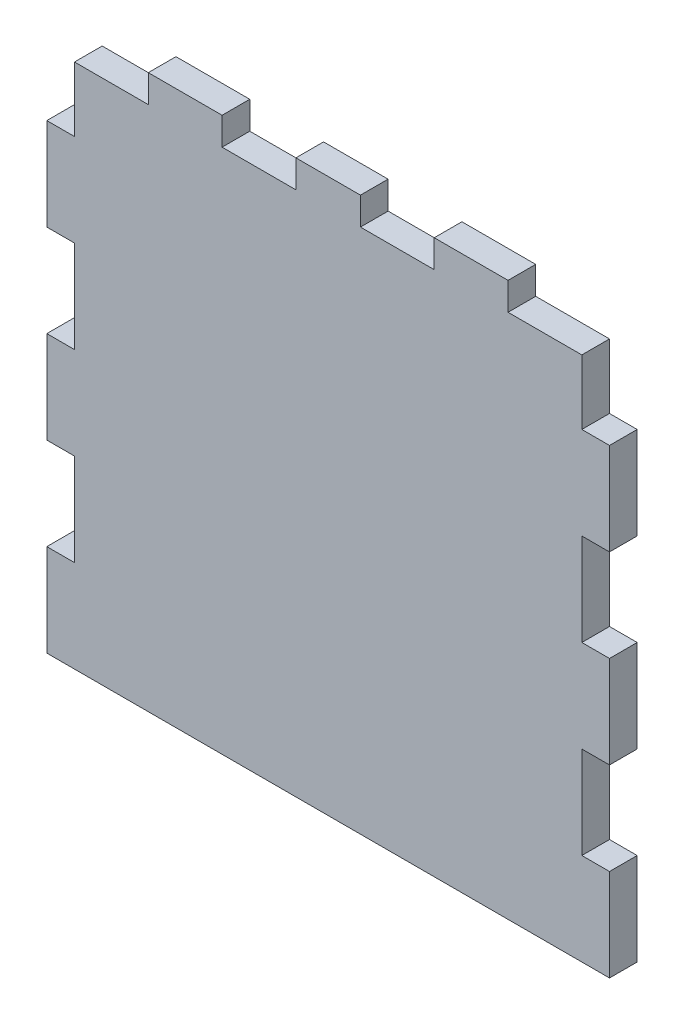
ISO-10303-21;
HEADER;
FILE_DESCRIPTION(('STEP AP214'),'2;1');
FILE_NAME('part.step','',(''),(''),'','','');
FILE_SCHEMA(('AUTOMOTIVE_DESIGN { 1 0 10303 214 1 1 1 1 }'));
ENDSEC;
DATA;
#1=APPLICATION_CONTEXT('core data for automotive mechanical design processes');
#2=APPLICATION_PROTOCOL_DEFINITION('international standard','automotive_design',2000,#1);
#3=PRODUCT_CONTEXT('',#1,'mechanical');
#4=PRODUCT('Part','Part','',(#3));
#5=PRODUCT_RELATED_PRODUCT_CATEGORY('part','',(#4));
#6=PRODUCT_DEFINITION_FORMATION('','',#4);
#7=PRODUCT_DEFINITION_CONTEXT('part definition',#1,'design');
#8=PRODUCT_DEFINITION('design','',#6,#7);
#9=PRODUCT_DEFINITION_SHAPE('','',#8);
#10=(LENGTH_UNIT() NAMED_UNIT(*) SI_UNIT(.MILLI.,.METRE.));
#11=(NAMED_UNIT(*) PLANE_ANGLE_UNIT() SI_UNIT($,.RADIAN.));
#12=(NAMED_UNIT(*) SI_UNIT($,.STERADIAN.) SOLID_ANGLE_UNIT());
#13=UNCERTAINTY_MEASURE_WITH_UNIT(LENGTH_MEASURE(1.E-05),#10,'distance_accuracy_value','');
#14=(GEOMETRIC_REPRESENTATION_CONTEXT(3) GLOBAL_UNCERTAINTY_ASSIGNED_CONTEXT((#13)) GLOBAL_UNIT_ASSIGNED_CONTEXT((#10,
#11,#12)) REPRESENTATION_CONTEXT('',''));
#15=CARTESIAN_POINT('',(0.,0.,0.));
#16=DIRECTION('',(0.,0.,1.));
#17=DIRECTION('',(1.,0.,0.));
#18=AXIS2_PLACEMENT_3D('',#15,#16,#17);
#19=CARTESIAN_POINT('',(0.,-60.,3.));
#20=DIRECTION('',(0.,1.,0.));
#21=DIRECTION('',(0.,0.,1.));
#22=AXIS2_PLACEMENT_3D('',#19,#20,#21);
#23=PLANE('',#22);
#24=DIRECTION('',(1.,0.,0.));
#25=VECTOR('',#24,1.);
#26=CARTESIAN_POINT('',(0.,-60.,0.));
#27=LINE('',#26,#25);
#28=CARTESIAN_POINT('',(-30.5,-60.,0.));
#29=VERTEX_POINT('',#28);
#30=CARTESIAN_POINT('',(30.5,-60.,0.));
#31=VERTEX_POINT('',#30);
#32=EDGE_CURVE('E303',#29,#31,#27,.T.);
#33=ORIENTED_EDGE('',*,*,#32,.T.);
#34=DIRECTION('',(0.,0.,-1.));
#35=VECTOR('',#34,1.);
#36=CARTESIAN_POINT('',(30.5,-60.,3.));
#37=LINE('',#36,#35);
#38=CARTESIAN_POINT('',(30.5,-60.,3.));
#39=VERTEX_POINT('',#38);
#40=EDGE_CURVE('E11',#39,#31,#37,.T.);
#41=ORIENTED_EDGE('',*,*,#40,.F.);
#42=DIRECTION('',(1.,0.,0.));
#43=VECTOR('',#42,1.);
#44=CARTESIAN_POINT('',(0.,-60.,3.));
#45=LINE('',#44,#43);
#46=CARTESIAN_POINT('',(-30.5,-60.,3.));
#47=VERTEX_POINT('',#46);
#48=EDGE_CURVE('E379',#47,#39,#45,.T.);
#49=ORIENTED_EDGE('',*,*,#48,.F.);
#50=DIRECTION('',(0.,0.,-1.));
#51=VECTOR('',#50,1.);
#52=CARTESIAN_POINT('',(-30.5,-60.,3.));
#53=LINE('',#52,#51);
#54=EDGE_CURVE('E298',#47,#29,#53,.T.);
#55=ORIENTED_EDGE('',*,*,#54,.T.);
#56=EDGE_LOOP('',(#33,#41,#49,#55));
#57=FACE_BOUND('',#56,.T.);
#58=ADVANCED_FACE('F37',(#57),#23,.F.);
#59=CARTESIAN_POINT('',(30.5,0.,3.));
#60=DIRECTION('',(-1.,0.,0.));
#61=DIRECTION('',(0.,0.,1.));
#62=AXIS2_PLACEMENT_3D('',#59,#60,#61);
#63=PLANE('',#62);
#64=DIRECTION('',(0.,1.,0.));
#65=VECTOR('',#64,1.);
#66=CARTESIAN_POINT('',(30.5,0.,0.));
#67=LINE('',#66,#65);
#68=CARTESIAN_POINT('',(30.5,-50.,0.));
#69=VERTEX_POINT('',#68);
#70=EDGE_CURVE('E306',#31,#69,#67,.T.);
#71=ORIENTED_EDGE('',*,*,#70,.T.);
#72=DIRECTION('',(0.,0.,-1.));
#73=VECTOR('',#72,1.);
#74=CARTESIAN_POINT('',(30.5,-50.,3.));
#75=LINE('',#74,#73);
#76=CARTESIAN_POINT('',(30.5,-50.,3.));
#77=VERTEX_POINT('',#76);
#78=EDGE_CURVE('E45',#77,#69,#75,.T.);
#79=ORIENTED_EDGE('',*,*,#78,.F.);
#80=DIRECTION('',(0.,1.,0.));
#81=VECTOR('',#80,1.);
#82=CARTESIAN_POINT('',(30.5,0.,3.));
#83=LINE('',#82,#81);
#84=EDGE_CURVE('E176',#39,#77,#83,.T.);
#85=ORIENTED_EDGE('',*,*,#84,.F.);
#86=ORIENTED_EDGE('',*,*,#40,.T.);
#87=EDGE_LOOP('',(#71,#79,#85,#86));
#88=FACE_BOUND('',#87,.T.);
#89=ADVANCED_FACE('F570',(#88),#63,.F.);
#90=CARTESIAN_POINT('',(0.,-50.,3.));
#91=DIRECTION('',(0.,-1.,0.));
#92=DIRECTION('',(0.,0.,-1.));
#93=AXIS2_PLACEMENT_3D('',#90,#91,#92);
#94=PLANE('',#93);
#95=DIRECTION('',(-1.,0.,0.));
#96=VECTOR('',#95,1.);
#97=CARTESIAN_POINT('',(0.,-50.,0.));
#98=LINE('',#97,#96);
#99=CARTESIAN_POINT('',(27.5,-50.,0.));
#100=VERTEX_POINT('',#99);
#101=EDGE_CURVE('E308',#69,#100,#98,.T.);
#102=ORIENTED_EDGE('',*,*,#101,.T.);
#103=DIRECTION('',(0.,0.,-1.));
#104=VECTOR('',#103,1.);
#105=CARTESIAN_POINT('',(27.5,-50.,3.));
#106=LINE('',#105,#104);
#107=CARTESIAN_POINT('',(27.5,-50.,3.));
#108=VERTEX_POINT('',#107);
#109=EDGE_CURVE('E456',#108,#100,#106,.T.);
#110=ORIENTED_EDGE('',*,*,#109,.F.);
#111=DIRECTION('',(-1.,0.,0.));
#112=VECTOR('',#111,1.);
#113=CARTESIAN_POINT('',(0.,-50.,3.));
#114=LINE('',#113,#112);
#115=EDGE_CURVE('E464',#77,#108,#114,.T.);
#116=ORIENTED_EDGE('',*,*,#115,.F.);
#117=ORIENTED_EDGE('',*,*,#78,.T.);
#118=EDGE_LOOP('',(#102,#110,#116,#117));
#119=FACE_BOUND('',#118,.T.);
#120=ADVANCED_FACE('F462',(#119),#94,.F.);
#121=CARTESIAN_POINT('',(27.5,0.,3.));
#122=DIRECTION('',(-1.,0.,0.));
#123=DIRECTION('',(0.,-1.,0.));
#124=AXIS2_PLACEMENT_3D('',#121,#122,#123);
#125=PLANE('',#124);
#126=DIRECTION('',(0.,1.,0.));
#127=VECTOR('',#126,1.);
#128=CARTESIAN_POINT('',(27.5,0.,0.));
#129=LINE('',#128,#127);
#130=CARTESIAN_POINT('',(27.5,-40.,0.));
#131=VERTEX_POINT('',#130);
#132=EDGE_CURVE('E310',#100,#131,#129,.T.);
#133=ORIENTED_EDGE('',*,*,#132,.T.);
#134=DIRECTION('',(0.,0.,-1.));
#135=VECTOR('',#134,1.);
#136=CARTESIAN_POINT('',(27.5,-40.,3.));
#137=LINE('',#136,#135);
#138=CARTESIAN_POINT('',(27.5,-40.,3.));
#139=VERTEX_POINT('',#138);
#140=EDGE_CURVE('E454',#139,#131,#137,.T.);
#141=ORIENTED_EDGE('',*,*,#140,.F.);
#142=DIRECTION('',(0.,1.,0.));
#143=VECTOR('',#142,1.);
#144=CARTESIAN_POINT('',(27.5,0.,3.));
#145=LINE('',#144,#143);
#146=EDGE_CURVE('E476',#108,#139,#145,.T.);
#147=ORIENTED_EDGE('',*,*,#146,.F.);
#148=ORIENTED_EDGE('',*,*,#109,.T.);
#149=EDGE_LOOP('',(#133,#141,#147,#148));
#150=FACE_BOUND('',#149,.T.);
#151=ADVANCED_FACE('F473',(#150),#125,.F.);
#152=CARTESIAN_POINT('',(0.,-40.,3.));
#153=DIRECTION('',(0.,-1.,0.));
#154=DIRECTION('',(0.,0.,-1.));
#155=AXIS2_PLACEMENT_3D('',#152,#153,#154);
#156=PLANE('',#155);
#157=DIRECTION('',(-1.,0.,0.));
#158=VECTOR('',#157,1.);
#159=CARTESIAN_POINT('',(0.,-40.,0.));
#160=LINE('',#159,#158);
#161=CARTESIAN_POINT('',(30.5,-40.,0.));
#162=VERTEX_POINT('',#161);
#163=EDGE_CURVE('E313',#162,#131,#160,.T.);
#164=ORIENTED_EDGE('',*,*,#163,.F.);
#165=DIRECTION('',(0.,0.,-1.));
#166=VECTOR('',#165,1.);
#167=CARTESIAN_POINT('',(30.5,-40.,3.));
#168=LINE('',#167,#166);
#169=CARTESIAN_POINT('',(30.5,-40.,3.));
#170=VERTEX_POINT('',#169);
#171=EDGE_CURVE('E452',#170,#162,#168,.T.);
#172=ORIENTED_EDGE('',*,*,#171,.F.);
#173=DIRECTION('',(-1.,0.,0.));
#174=VECTOR('',#173,1.);
#175=CARTESIAN_POINT('',(0.,-40.,3.));
#176=LINE('',#175,#174);
#177=EDGE_CURVE('E478',#170,#139,#176,.T.);
#178=ORIENTED_EDGE('',*,*,#177,.T.);
#179=ORIENTED_EDGE('',*,*,#140,.T.);
#180=EDGE_LOOP('',(#164,#172,#178,#179));
#181=FACE_BOUND('',#180,.T.);
#182=ADVANCED_FACE('F938',(#181),#156,.T.);
#183=CARTESIAN_POINT('',(30.5,0.,3.));
#184=DIRECTION('',(-1.,0.,0.));
#185=DIRECTION('',(0.,0.,1.));
#186=AXIS2_PLACEMENT_3D('',#183,#184,#185);
#187=PLANE('',#186);
#188=DIRECTION('',(0.,1.,0.));
#189=VECTOR('',#188,1.);
#190=CARTESIAN_POINT('',(30.5,0.,0.));
#191=LINE('',#190,#189);
#192=CARTESIAN_POINT('',(30.5,-30.,0.));
#193=VERTEX_POINT('',#192);
#194=EDGE_CURVE('E318',#162,#193,#191,.T.);
#195=ORIENTED_EDGE('',*,*,#194,.T.);
#196=DIRECTION('',(0.,0.,-1.));
#197=VECTOR('',#196,1.);
#198=CARTESIAN_POINT('',(30.5,-30.,3.));
#199=LINE('',#198,#197);
#200=CARTESIAN_POINT('',(30.5,-30.,3.));
#201=VERTEX_POINT('',#200);
#202=EDGE_CURVE('E449',#201,#193,#199,.T.);
#203=ORIENTED_EDGE('',*,*,#202,.F.);
#204=DIRECTION('',(0.,1.,0.));
#205=VECTOR('',#204,1.);
#206=CARTESIAN_POINT('',(30.5,0.,3.));
#207=LINE('',#206,#205);
#208=EDGE_CURVE('E482',#170,#201,#207,.T.);
#209=ORIENTED_EDGE('',*,*,#208,.F.);
#210=ORIENTED_EDGE('',*,*,#171,.T.);
#211=EDGE_LOOP('',(#195,#203,#209,#210));
#212=FACE_BOUND('',#211,.T.);
#213=ADVANCED_FACE('F928',(#212),#187,.F.);
#214=CARTESIAN_POINT('',(0.,-29.9999999999999,3.));
#215=DIRECTION('',(0.,-1.,0.));
#216=DIRECTION('',(1.,0.,0.));
#217=AXIS2_PLACEMENT_3D('',#214,#215,#216);
#218=PLANE('',#217);
#219=DIRECTION('',(-1.,0.,0.));
#220=VECTOR('',#219,1.);
#221=CARTESIAN_POINT('',(0.,-29.9999999999999,0.));
#222=LINE('',#221,#220);
#223=CARTESIAN_POINT('',(27.5,-30.,0.));
#224=VERTEX_POINT('',#223);
#225=EDGE_CURVE('E320',#193,#224,#222,.T.);
#226=ORIENTED_EDGE('',*,*,#225,.T.);
#227=DIRECTION('',(0.,0.,-1.));
#228=VECTOR('',#227,1.);
#229=CARTESIAN_POINT('',(27.5,-30.,3.));
#230=LINE('',#229,#228);
#231=CARTESIAN_POINT('',(27.5,-30.,3.));
#232=VERTEX_POINT('',#231);
#233=EDGE_CURVE('E446',#232,#224,#230,.T.);
#234=ORIENTED_EDGE('',*,*,#233,.F.);
#235=DIRECTION('',(-1.,0.,0.));
#236=VECTOR('',#235,1.);
#237=CARTESIAN_POINT('',(0.,-29.9999999999999,3.));
#238=LINE('',#237,#236);
#239=EDGE_CURVE('E488',#201,#232,#238,.T.);
#240=ORIENTED_EDGE('',*,*,#239,.F.);
#241=ORIENTED_EDGE('',*,*,#202,.T.);
#242=EDGE_LOOP('',(#226,#234,#240,#241));
#243=FACE_BOUND('',#242,.T.);
#244=ADVANCED_FACE('F919',(#243),#218,.F.);
#245=CARTESIAN_POINT('',(27.5,-20.,0.));
#246=VERTEX_POINT('',#245);
#247=EDGE_CURVE('E315',#224,#246,#129,.T.);
#248=ORIENTED_EDGE('',*,*,#247,.T.);
#249=DIRECTION('',(0.,0.,-1.));
#250=VECTOR('',#249,1.);
#251=CARTESIAN_POINT('',(27.5,-20.,3.));
#252=LINE('',#251,#250);
#253=CARTESIAN_POINT('',(27.5,-20.,3.));
#254=VERTEX_POINT('',#253);
#255=EDGE_CURVE('E444',#254,#246,#252,.T.);
#256=ORIENTED_EDGE('',*,*,#255,.F.);
#257=EDGE_CURVE('E481',#232,#254,#145,.T.);
#258=ORIENTED_EDGE('',*,*,#257,.F.);
#259=ORIENTED_EDGE('',*,*,#233,.T.);
#260=EDGE_LOOP('',(#248,#256,#258,#259));
#261=FACE_BOUND('',#260,.T.);
#262=ADVANCED_FACE('F881',(#261),#125,.F.);
#263=CARTESIAN_POINT('',(0.,-19.9999999999999,3.));
#264=DIRECTION('',(0.,-1.,0.));
#265=DIRECTION('',(1.,0.,0.));
#266=AXIS2_PLACEMENT_3D('',#263,#264,#265);
#267=PLANE('',#266);
#268=DIRECTION('',(-1.,0.,0.));
#269=VECTOR('',#268,1.);
#270=CARTESIAN_POINT('',(0.,-19.9999999999999,0.));
#271=LINE('',#270,#269);
#272=CARTESIAN_POINT('',(30.5,-20.,0.));
#273=VERTEX_POINT('',#272);
#274=EDGE_CURVE('E322',#273,#246,#271,.T.);
#275=ORIENTED_EDGE('',*,*,#274,.F.);
#276=DIRECTION('',(0.,0.,-1.));
#277=VECTOR('',#276,1.);
#278=CARTESIAN_POINT('',(30.5,-20.,3.));
#279=LINE('',#278,#277);
#280=CARTESIAN_POINT('',(30.5,-20.,3.));
#281=VERTEX_POINT('',#280);
#282=EDGE_CURVE('E442',#281,#273,#279,.T.);
#283=ORIENTED_EDGE('',*,*,#282,.F.);
#284=DIRECTION('',(-1.,0.,0.));
#285=VECTOR('',#284,1.);
#286=CARTESIAN_POINT('',(0.,-19.9999999999999,3.));
#287=LINE('',#286,#285);
#288=EDGE_CURVE('E487',#281,#254,#287,.T.);
#289=ORIENTED_EDGE('',*,*,#288,.T.);
#290=ORIENTED_EDGE('',*,*,#255,.T.);
#291=EDGE_LOOP('',(#275,#283,#289,#290));
#292=FACE_BOUND('',#291,.T.);
#293=ADVANCED_FACE('F899',(#292),#267,.T.);
#294=CARTESIAN_POINT('',(30.5,0.,3.));
#295=DIRECTION('',(-1.,0.,0.));
#296=DIRECTION('',(0.,0.,1.));
#297=AXIS2_PLACEMENT_3D('',#294,#295,#296);
#298=PLANE('',#297);
#299=DIRECTION('',(0.,1.,0.));
#300=VECTOR('',#299,1.);
#301=CARTESIAN_POINT('',(30.5,0.,0.));
#302=LINE('',#301,#300);
#303=CARTESIAN_POINT('',(30.5,-10.,0.));
#304=VERTEX_POINT('',#303);
#305=EDGE_CURVE('E325',#273,#304,#302,.T.);
#306=ORIENTED_EDGE('',*,*,#305,.T.);
#307=DIRECTION('',(0.,0.,-1.));
#308=VECTOR('',#307,1.);
#309=CARTESIAN_POINT('',(30.5,-10.,3.));
#310=LINE('',#309,#308);
#311=CARTESIAN_POINT('',(30.5,-10.,3.));
#312=VERTEX_POINT('',#311);
#313=EDGE_CURVE('E439',#312,#304,#310,.T.);
#314=ORIENTED_EDGE('',*,*,#313,.F.);
#315=DIRECTION('',(0.,1.,0.));
#316=VECTOR('',#315,1.);
#317=CARTESIAN_POINT('',(30.5,0.,3.));
#318=LINE('',#317,#316);
#319=EDGE_CURVE('E493',#281,#312,#318,.T.);
#320=ORIENTED_EDGE('',*,*,#319,.F.);
#321=ORIENTED_EDGE('',*,*,#282,.T.);
#322=EDGE_LOOP('',(#306,#314,#320,#321));
#323=FACE_BOUND('',#322,.T.);
#324=ADVANCED_FACE('F889',(#323),#298,.F.);
#325=CARTESIAN_POINT('',(0.,-10.,3.));
#326=DIRECTION('',(0.,-1.,0.));
#327=DIRECTION('',(0.,0.,-1.));
#328=AXIS2_PLACEMENT_3D('',#325,#326,#327);
#329=PLANE('',#328);
#330=DIRECTION('',(-1.,0.,0.));
#331=VECTOR('',#330,1.);
#332=CARTESIAN_POINT('',(0.,-10.,0.));
#333=LINE('',#332,#331);
#334=CARTESIAN_POINT('',(27.5,-10.,0.));
#335=VERTEX_POINT('',#334);
#336=EDGE_CURVE('E327',#304,#335,#333,.T.);
#337=ORIENTED_EDGE('',*,*,#336,.T.);
#338=DIRECTION('',(0.,0.,-1.));
#339=VECTOR('',#338,1.);
#340=CARTESIAN_POINT('',(27.5,-10.,3.));
#341=LINE('',#340,#339);
#342=CARTESIAN_POINT('',(27.5,-10.,3.));
#343=VERTEX_POINT('',#342);
#344=EDGE_CURVE('E436',#343,#335,#341,.T.);
#345=ORIENTED_EDGE('',*,*,#344,.F.);
#346=DIRECTION('',(-1.,0.,0.));
#347=VECTOR('',#346,1.);
#348=CARTESIAN_POINT('',(0.,-10.,3.));
#349=LINE('',#348,#347);
#350=EDGE_CURVE('E486',#312,#343,#349,.T.);
#351=ORIENTED_EDGE('',*,*,#350,.F.);
#352=ORIENTED_EDGE('',*,*,#313,.T.);
#353=EDGE_LOOP('',(#337,#345,#351,#352));
#354=FACE_BOUND('',#353,.T.);
#355=ADVANCED_FACE('F878',(#354),#329,.F.);
#356=CARTESIAN_POINT('',(27.5,-3.,0.));
#357=VERTEX_POINT('',#356);
#358=EDGE_CURVE('E314',#335,#357,#129,.T.);
#359=ORIENTED_EDGE('',*,*,#358,.T.);
#360=DIRECTION('',(0.,0.,-1.));
#361=VECTOR('',#360,1.);
#362=CARTESIAN_POINT('',(27.5,-3.,3.));
#363=LINE('',#362,#361);
#364=CARTESIAN_POINT('',(27.5,-3.,3.));
#365=VERTEX_POINT('',#364);
#366=EDGE_CURVE('E433',#365,#357,#363,.T.);
#367=ORIENTED_EDGE('',*,*,#366,.F.);
#368=EDGE_CURVE('E480',#343,#365,#145,.T.);
#369=ORIENTED_EDGE('',*,*,#368,.F.);
#370=ORIENTED_EDGE('',*,*,#344,.T.);
#371=EDGE_LOOP('',(#359,#367,#369,#370));
#372=FACE_BOUND('',#371,.T.);
#373=ADVANCED_FACE('F868',(#372),#125,.F.);
#374=CARTESIAN_POINT('',(0.,-3.,3.));
#375=DIRECTION('',(0.,-1.,0.));
#376=DIRECTION('',(0.,0.,-1.));
#377=AXIS2_PLACEMENT_3D('',#374,#375,#376);
#378=PLANE('',#377);
#379=DIRECTION('',(-1.,0.,0.));
#380=VECTOR('',#379,1.);
#381=CARTESIAN_POINT('',(0.,-3.,0.));
#382=LINE('',#381,#380);
#383=CARTESIAN_POINT('',(19.5000000000006,-3.,0.));
#384=VERTEX_POINT('',#383);
#385=EDGE_CURVE('E329',#357,#384,#382,.T.);
#386=ORIENTED_EDGE('',*,*,#385,.T.);
#387=DIRECTION('',(0.,0.,-1.));
#388=VECTOR('',#387,1.);
#389=CARTESIAN_POINT('',(19.5000000000006,-3.,3.));
#390=LINE('',#389,#388);
#391=CARTESIAN_POINT('',(19.5000000000006,-3.,3.));
#392=VERTEX_POINT('',#391);
#393=EDGE_CURVE('E431',#392,#384,#390,.T.);
#394=ORIENTED_EDGE('',*,*,#393,.F.);
#395=DIRECTION('',(-1.,0.,0.));
#396=VECTOR('',#395,1.);
#397=CARTESIAN_POINT('',(0.,-3.,3.));
#398=LINE('',#397,#396);
#399=EDGE_CURVE('E485',#365,#392,#398,.T.);
#400=ORIENTED_EDGE('',*,*,#399,.F.);
#401=ORIENTED_EDGE('',*,*,#366,.T.);
#402=EDGE_LOOP('',(#386,#394,#400,#401));
#403=FACE_BOUND('',#402,.T.);
#404=ADVANCED_FACE('F830',(#403),#378,.F.);
#405=CARTESIAN_POINT('',(19.5000000000006,0.,3.));
#406=DIRECTION('',(1.,0.,0.));
#407=DIRECTION('',(0.,0.,-1.));
#408=AXIS2_PLACEMENT_3D('',#405,#406,#407);
#409=PLANE('',#408);
#410=DIRECTION('',(0.,-1.,0.));
#411=VECTOR('',#410,1.);
#412=CARTESIAN_POINT('',(19.5000000000006,0.,0.));
#413=LINE('',#412,#411);
#414=CARTESIAN_POINT('',(19.5000000000006,0.,0.));
#415=VERTEX_POINT('',#414);
#416=EDGE_CURVE('E332',#415,#384,#413,.T.);
#417=ORIENTED_EDGE('',*,*,#416,.F.);
#418=DIRECTION('',(0.,0.,-1.));
#419=VECTOR('',#418,1.);
#420=CARTESIAN_POINT('',(19.5000000000006,0.,3.));
#421=LINE('',#420,#419);
#422=CARTESIAN_POINT('',(19.5000000000006,0.,3.));
#423=VERTEX_POINT('',#422);
#424=EDGE_CURVE('E429',#423,#415,#421,.T.);
#425=ORIENTED_EDGE('',*,*,#424,.F.);
#426=DIRECTION('',(0.,-1.,0.));
#427=VECTOR('',#426,1.);
#428=CARTESIAN_POINT('',(19.5000000000006,0.,3.));
#429=LINE('',#428,#427);
#430=EDGE_CURVE('E503',#423,#392,#429,.T.);
#431=ORIENTED_EDGE('',*,*,#430,.T.);
#432=ORIENTED_EDGE('',*,*,#393,.T.);
#433=EDGE_LOOP('',(#417,#425,#431,#432));
#434=FACE_BOUND('',#433,.T.);
#435=ADVANCED_FACE('F848',(#434),#409,.T.);
#436=CARTESIAN_POINT('',(0.,0.,3.));
#437=DIRECTION('',(0.,-1.,0.));
#438=DIRECTION('',(0.,0.,-1.));
#439=AXIS2_PLACEMENT_3D('',#436,#437,#438);
#440=PLANE('',#439);
#441=DIRECTION('',(-1.,0.,0.));
#442=VECTOR('',#441,1.);
#443=CARTESIAN_POINT('',(0.,0.,0.));
#444=LINE('',#443,#442);
#445=CARTESIAN_POINT('',(11.5,0.,0.));
#446=VERTEX_POINT('',#445);
#447=EDGE_CURVE('E336',#415,#446,#444,.T.);
#448=ORIENTED_EDGE('',*,*,#447,.T.);
#449=DIRECTION('',(0.,0.,-1.));
#450=VECTOR('',#449,1.);
#451=CARTESIAN_POINT('',(11.5,0.,3.));
#452=LINE('',#451,#450);
#453=CARTESIAN_POINT('',(11.5,0.,3.));
#454=VERTEX_POINT('',#453);
#455=EDGE_CURVE('E426',#454,#446,#452,.T.);
#456=ORIENTED_EDGE('',*,*,#455,.F.);
#457=DIRECTION('',(-1.,0.,0.));
#458=VECTOR('',#457,1.);
#459=CARTESIAN_POINT('',(0.,0.,3.));
#460=LINE('',#459,#458);
#461=EDGE_CURVE('E507',#423,#454,#460,.T.);
#462=ORIENTED_EDGE('',*,*,#461,.F.);
#463=ORIENTED_EDGE('',*,*,#424,.T.);
#464=EDGE_LOOP('',(#448,#456,#462,#463));
#465=FACE_BOUND('',#464,.T.);
#466=ADVANCED_FACE('F838',(#465),#440,.F.);
#467=CARTESIAN_POINT('',(11.5,0.,3.));
#468=DIRECTION('',(1.,0.,0.));
#469=DIRECTION('',(0.,0.,-1.));
#470=AXIS2_PLACEMENT_3D('',#467,#468,#469);
#471=PLANE('',#470);
#472=DIRECTION('',(0.,-1.,0.));
#473=VECTOR('',#472,1.);
#474=CARTESIAN_POINT('',(11.5,0.,0.));
#475=LINE('',#474,#473);
#476=CARTESIAN_POINT('',(11.5,-3.,0.));
#477=VERTEX_POINT('',#476);
#478=EDGE_CURVE('E338',#446,#477,#475,.T.);
#479=ORIENTED_EDGE('',*,*,#478,.T.);
#480=DIRECTION('',(0.,0.,-1.));
#481=VECTOR('',#480,1.);
#482=CARTESIAN_POINT('',(11.5,-3.,3.));
#483=LINE('',#482,#481);
#484=CARTESIAN_POINT('',(11.5,-3.,3.));
#485=VERTEX_POINT('',#484);
#486=EDGE_CURVE('E423',#485,#477,#483,.T.);
#487=ORIENTED_EDGE('',*,*,#486,.F.);
#488=DIRECTION('',(0.,-1.,0.));
#489=VECTOR('',#488,1.);
#490=CARTESIAN_POINT('',(11.5,0.,3.));
#491=LINE('',#490,#489);
#492=EDGE_CURVE('E509',#454,#485,#491,.T.);
#493=ORIENTED_EDGE('',*,*,#492,.F.);
#494=ORIENTED_EDGE('',*,*,#455,.T.);
#495=EDGE_LOOP('',(#479,#487,#493,#494));
#496=FACE_BOUND('',#495,.T.);
#497=ADVANCED_FACE('F827',(#496),#471,.F.);
#498=CARTESIAN_POINT('',(3.50000000000001,-3.,0.));
#499=VERTEX_POINT('',#498);
#500=EDGE_CURVE('E333',#477,#499,#382,.T.);
#501=ORIENTED_EDGE('',*,*,#500,.T.);
#502=DIRECTION('',(0.,0.,-1.));
#503=VECTOR('',#502,1.);
#504=CARTESIAN_POINT('',(3.50000000000001,-3.,3.));
#505=LINE('',#504,#503);
#506=CARTESIAN_POINT('',(3.50000000000001,-3.,3.));
#507=VERTEX_POINT('',#506);
#508=EDGE_CURVE('E421',#507,#499,#505,.T.);
#509=ORIENTED_EDGE('',*,*,#508,.F.);
#510=EDGE_CURVE('E504',#485,#507,#398,.T.);
#511=ORIENTED_EDGE('',*,*,#510,.F.);
#512=ORIENTED_EDGE('',*,*,#486,.T.);
#513=EDGE_LOOP('',(#501,#509,#511,#512));
#514=FACE_BOUND('',#513,.T.);
#515=ADVANCED_FACE('F816',(#514),#378,.F.);
#516=CARTESIAN_POINT('',(3.50000000000001,0.,3.));
#517=DIRECTION('',(1.,0.,0.));
#518=DIRECTION('',(0.,0.,-1.));
#519=AXIS2_PLACEMENT_3D('',#516,#517,#518);
#520=PLANE('',#519);
#521=DIRECTION('',(0.,-1.,0.));
#522=VECTOR('',#521,1.);
#523=CARTESIAN_POINT('',(3.50000000000001,0.,0.));
#524=LINE('',#523,#522);
#525=CARTESIAN_POINT('',(3.50000000000001,0.,0.));
#526=VERTEX_POINT('',#525);
#527=EDGE_CURVE('E340',#526,#499,#524,.T.);
#528=ORIENTED_EDGE('',*,*,#527,.F.);
#529=DIRECTION('',(0.,0.,-1.));
#530=VECTOR('',#529,1.);
#531=CARTESIAN_POINT('',(3.50000000000001,0.,3.));
#532=LINE('',#531,#530);
#533=CARTESIAN_POINT('',(3.50000000000001,0.,3.));
#534=VERTEX_POINT('',#533);
#535=EDGE_CURVE('E419',#534,#526,#532,.T.);
#536=ORIENTED_EDGE('',*,*,#535,.F.);
#537=DIRECTION('',(0.,-1.,0.));
#538=VECTOR('',#537,1.);
#539=CARTESIAN_POINT('',(3.50000000000001,0.,3.));
#540=LINE('',#539,#538);
#541=EDGE_CURVE('E511',#534,#507,#540,.T.);
#542=ORIENTED_EDGE('',*,*,#541,.T.);
#543=ORIENTED_EDGE('',*,*,#508,.T.);
#544=EDGE_LOOP('',(#528,#536,#542,#543));
#545=FACE_BOUND('',#544,.T.);
#546=ADVANCED_FACE('F806',(#545),#520,.T.);
#547=CARTESIAN_POINT('',(0.,0.,3.));
#548=DIRECTION('',(0.,-1.,0.));
#549=DIRECTION('',(0.,0.,-1.));
#550=AXIS2_PLACEMENT_3D('',#547,#548,#549);
#551=PLANE('',#550);
#552=DIRECTION('',(-1.,0.,0.));
#553=VECTOR('',#552,1.);
#554=CARTESIAN_POINT('',(0.,0.,0.));
#555=LINE('',#554,#553);
#556=CARTESIAN_POINT('',(-3.50000000000001,0.,0.));
#557=VERTEX_POINT('',#556);
#558=EDGE_CURVE('E343',#526,#557,#555,.T.);
#559=ORIENTED_EDGE('',*,*,#558,.T.);
#560=DIRECTION('',(0.,0.,-1.));
#561=VECTOR('',#560,1.);
#562=CARTESIAN_POINT('',(-3.50000000000001,0.,3.));
#563=LINE('',#562,#561);
#564=CARTESIAN_POINT('',(-3.50000000000001,0.,3.));
#565=VERTEX_POINT('',#564);
#566=EDGE_CURVE('E416',#565,#557,#563,.T.);
#567=ORIENTED_EDGE('',*,*,#566,.F.);
#568=DIRECTION('',(-1.,0.,0.));
#569=VECTOR('',#568,1.);
#570=CARTESIAN_POINT('',(0.,0.,3.));
#571=LINE('',#570,#569);
#572=EDGE_CURVE('E514',#534,#565,#571,.T.);
#573=ORIENTED_EDGE('',*,*,#572,.F.);
#574=ORIENTED_EDGE('',*,*,#535,.T.);
#575=EDGE_LOOP('',(#559,#567,#573,#574));
#576=FACE_BOUND('',#575,.T.);
#577=ADVANCED_FACE('F796',(#576),#551,.F.);
#578=CARTESIAN_POINT('',(-3.50000000000001,0.,3.));
#579=DIRECTION('',(1.,0.,0.));
#580=DIRECTION('',(0.,0.,-1.));
#581=AXIS2_PLACEMENT_3D('',#578,#579,#580);
#582=PLANE('',#581);
#583=DIRECTION('',(0.,-1.,0.));
#584=VECTOR('',#583,1.);
#585=CARTESIAN_POINT('',(-3.50000000000001,0.,0.));
#586=LINE('',#585,#584);
#587=CARTESIAN_POINT('',(-3.50000000000001,-3.,0.));
#588=VERTEX_POINT('',#587);
#589=EDGE_CURVE('E345',#557,#588,#586,.T.);
#590=ORIENTED_EDGE('',*,*,#589,.T.);
#591=DIRECTION('',(0.,0.,-1.));
#592=VECTOR('',#591,1.);
#593=CARTESIAN_POINT('',(-3.50000000000001,-3.,3.));
#594=LINE('',#593,#592);
#595=CARTESIAN_POINT('',(-3.50000000000001,-3.,3.));
#596=VERTEX_POINT('',#595);
#597=EDGE_CURVE('E413',#596,#588,#594,.T.);
#598=ORIENTED_EDGE('',*,*,#597,.F.);
#599=DIRECTION('',(0.,-1.,0.));
#600=VECTOR('',#599,1.);
#601=CARTESIAN_POINT('',(-3.50000000000001,0.,3.));
#602=LINE('',#601,#600);
#603=EDGE_CURVE('E516',#565,#596,#602,.T.);
#604=ORIENTED_EDGE('',*,*,#603,.F.);
#605=ORIENTED_EDGE('',*,*,#566,.T.);
#606=EDGE_LOOP('',(#590,#598,#604,#605));
#607=FACE_BOUND('',#606,.T.);
#608=ADVANCED_FACE('F787',(#607),#582,.F.);
#609=CARTESIAN_POINT('',(0.,-3.,3.));
#610=DIRECTION('',(0.,-1.,0.));
#611=DIRECTION('',(0.,0.,-1.));
#612=AXIS2_PLACEMENT_3D('',#609,#610,#611);
#613=PLANE('',#612);
#614=DIRECTION('',(-1.,0.,0.));
#615=VECTOR('',#614,1.);
#616=CARTESIAN_POINT('',(0.,-3.,0.));
#617=LINE('',#616,#615);
#618=CARTESIAN_POINT('',(-11.5,-3.,0.));
#619=VERTEX_POINT('',#618);
#620=EDGE_CURVE('E347',#588,#619,#617,.T.);
#621=ORIENTED_EDGE('',*,*,#620,.T.);
#622=DIRECTION('',(0.,0.,-1.));
#623=VECTOR('',#622,1.);
#624=CARTESIAN_POINT('',(-11.5,-3.,3.));
#625=LINE('',#624,#623);
#626=CARTESIAN_POINT('',(-11.5,-3.,3.));
#627=VERTEX_POINT('',#626);
#628=EDGE_CURVE('E411',#627,#619,#625,.T.);
#629=ORIENTED_EDGE('',*,*,#628,.F.);
#630=DIRECTION('',(-1.,0.,0.));
#631=VECTOR('',#630,1.);
#632=CARTESIAN_POINT('',(0.,-3.,3.));
#633=LINE('',#632,#631);
#634=EDGE_CURVE('E518',#596,#627,#633,.T.);
#635=ORIENTED_EDGE('',*,*,#634,.F.);
#636=ORIENTED_EDGE('',*,*,#597,.T.);
#637=EDGE_LOOP('',(#621,#629,#635,#636));
#638=FACE_BOUND('',#637,.T.);
#639=ADVANCED_FACE('F749',(#638),#613,.F.);
#640=CARTESIAN_POINT('',(-11.5,0.,3.));
#641=DIRECTION('',(1.,0.,0.));
#642=DIRECTION('',(0.,0.,-1.));
#643=AXIS2_PLACEMENT_3D('',#640,#641,#642);
#644=PLANE('',#643);
#645=DIRECTION('',(0.,-1.,0.));
#646=VECTOR('',#645,1.);
#647=CARTESIAN_POINT('',(-11.5,0.,0.));
#648=LINE('',#647,#646);
#649=CARTESIAN_POINT('',(-11.5,0.,0.));
#650=VERTEX_POINT('',#649);
#651=EDGE_CURVE('E350',#650,#619,#648,.T.);
#652=ORIENTED_EDGE('',*,*,#651,.F.);
#653=DIRECTION('',(0.,0.,-1.));
#654=VECTOR('',#653,1.);
#655=CARTESIAN_POINT('',(-11.5,0.,3.));
#656=LINE('',#655,#654);
#657=CARTESIAN_POINT('',(-11.5,0.,3.));
#658=VERTEX_POINT('',#657);
#659=EDGE_CURVE('E409',#658,#650,#656,.T.);
#660=ORIENTED_EDGE('',*,*,#659,.F.);
#661=DIRECTION('',(0.,-1.,0.));
#662=VECTOR('',#661,1.);
#663=CARTESIAN_POINT('',(-11.5,0.,3.));
#664=LINE('',#663,#662);
#665=EDGE_CURVE('E520',#658,#627,#664,.T.);
#666=ORIENTED_EDGE('',*,*,#665,.T.);
#667=ORIENTED_EDGE('',*,*,#628,.T.);
#668=EDGE_LOOP('',(#652,#660,#666,#667));
#669=FACE_BOUND('',#668,.T.);
#670=ADVANCED_FACE('F767',(#669),#644,.T.);
#671=CARTESIAN_POINT('',(0.,0.,3.));
#672=DIRECTION('',(0.,-1.,0.));
#673=DIRECTION('',(0.,0.,-1.));
#674=AXIS2_PLACEMENT_3D('',#671,#672,#673);
#675=PLANE('',#674);
#676=DIRECTION('',(-1.,0.,0.));
#677=VECTOR('',#676,1.);
#678=CARTESIAN_POINT('',(0.,0.,0.));
#679=LINE('',#678,#677);
#680=CARTESIAN_POINT('',(-19.5,0.,0.));
#681=VERTEX_POINT('',#680);
#682=EDGE_CURVE('E354',#650,#681,#679,.T.);
#683=ORIENTED_EDGE('',*,*,#682,.T.);
#684=DIRECTION('',(0.,0.,-1.));
#685=VECTOR('',#684,1.);
#686=CARTESIAN_POINT('',(-19.5,0.,3.));
#687=LINE('',#686,#685);
#688=CARTESIAN_POINT('',(-19.5,0.,3.));
#689=VERTEX_POINT('',#688);
#690=EDGE_CURVE('E406',#689,#681,#687,.T.);
#691=ORIENTED_EDGE('',*,*,#690,.F.);
#692=DIRECTION('',(-1.,0.,0.));
#693=VECTOR('',#692,1.);
#694=CARTESIAN_POINT('',(0.,0.,3.));
#695=LINE('',#694,#693);
#696=EDGE_CURVE('E524',#658,#689,#695,.T.);
#697=ORIENTED_EDGE('',*,*,#696,.F.);
#698=ORIENTED_EDGE('',*,*,#659,.T.);
#699=EDGE_LOOP('',(#683,#691,#697,#698));
#700=FACE_BOUND('',#699,.T.);
#701=ADVANCED_FACE('F757',(#700),#675,.F.);
#702=CARTESIAN_POINT('',(-19.5,0.,3.));
#703=DIRECTION('',(1.,0.,0.));
#704=DIRECTION('',(0.,0.,-1.));
#705=AXIS2_PLACEMENT_3D('',#702,#703,#704);
#706=PLANE('',#705);
#707=DIRECTION('',(0.,-1.,0.));
#708=VECTOR('',#707,1.);
#709=CARTESIAN_POINT('',(-19.5,0.,0.));
#710=LINE('',#709,#708);
#711=CARTESIAN_POINT('',(-19.5,-3.,0.));
#712=VERTEX_POINT('',#711);
#713=EDGE_CURVE('E356',#681,#712,#710,.T.);
#714=ORIENTED_EDGE('',*,*,#713,.T.);
#715=DIRECTION('',(0.,0.,-1.));
#716=VECTOR('',#715,1.);
#717=CARTESIAN_POINT('',(-19.5,-3.,3.));
#718=LINE('',#717,#716);
#719=CARTESIAN_POINT('',(-19.5,-3.,3.));
#720=VERTEX_POINT('',#719);
#721=EDGE_CURVE('E403',#720,#712,#718,.T.);
#722=ORIENTED_EDGE('',*,*,#721,.F.);
#723=DIRECTION('',(0.,-1.,0.));
#724=VECTOR('',#723,1.);
#725=CARTESIAN_POINT('',(-19.5,0.,3.));
#726=LINE('',#725,#724);
#727=EDGE_CURVE('E526',#689,#720,#726,.T.);
#728=ORIENTED_EDGE('',*,*,#727,.F.);
#729=ORIENTED_EDGE('',*,*,#690,.T.);
#730=EDGE_LOOP('',(#714,#722,#728,#729));
#731=FACE_BOUND('',#730,.T.);
#732=ADVANCED_FACE('F746',(#731),#706,.F.);
#733=CARTESIAN_POINT('',(-27.5,-3.,0.));
#734=VERTEX_POINT('',#733);
#735=EDGE_CURVE('E351',#712,#734,#617,.T.);
#736=ORIENTED_EDGE('',*,*,#735,.T.);
#737=DIRECTION('',(0.,0.,-1.));
#738=VECTOR('',#737,1.);
#739=CARTESIAN_POINT('',(-27.5,-3.,3.));
#740=LINE('',#739,#738);
#741=CARTESIAN_POINT('',(-27.5,-3.,3.));
#742=VERTEX_POINT('',#741);
#743=EDGE_CURVE('E400',#742,#734,#740,.T.);
#744=ORIENTED_EDGE('',*,*,#743,.F.);
#745=EDGE_CURVE('E521',#720,#742,#633,.T.);
#746=ORIENTED_EDGE('',*,*,#745,.F.);
#747=ORIENTED_EDGE('',*,*,#721,.T.);
#748=EDGE_LOOP('',(#736,#744,#746,#747));
#749=FACE_BOUND('',#748,.T.);
#750=ADVANCED_FACE('F736',(#749),#613,.F.);
#751=CARTESIAN_POINT('',(-27.5,0.,3.));
#752=DIRECTION('',(1.,0.,0.));
#753=DIRECTION('',(0.,0.,-1.));
#754=AXIS2_PLACEMENT_3D('',#751,#752,#753);
#755=PLANE('',#754);
#756=DIRECTION('',(0.,-1.,0.));
#757=VECTOR('',#756,1.);
#758=CARTESIAN_POINT('',(-27.5,0.,0.));
#759=LINE('',#758,#757);
#760=CARTESIAN_POINT('',(-27.5,-10.,0.));
#761=VERTEX_POINT('',#760);
#762=EDGE_CURVE('E358',#734,#761,#759,.T.);
#763=ORIENTED_EDGE('',*,*,#762,.T.);
#764=DIRECTION('',(0.,0.,-1.));
#765=VECTOR('',#764,1.);
#766=CARTESIAN_POINT('',(-27.5,-10.,3.));
#767=LINE('',#766,#765);
#768=CARTESIAN_POINT('',(-27.5,-10.,3.));
#769=VERTEX_POINT('',#768);
#770=EDGE_CURVE('E398',#769,#761,#767,.T.);
#771=ORIENTED_EDGE('',*,*,#770,.F.);
#772=DIRECTION('',(0.,-1.,0.));
#773=VECTOR('',#772,1.);
#774=CARTESIAN_POINT('',(-27.5,0.,3.));
#775=LINE('',#774,#773);
#776=EDGE_CURVE('E285',#742,#769,#775,.T.);
#777=ORIENTED_EDGE('',*,*,#776,.F.);
#778=ORIENTED_EDGE('',*,*,#743,.T.);
#779=EDGE_LOOP('',(#763,#771,#777,#778));
#780=FACE_BOUND('',#779,.T.);
#781=ADVANCED_FACE('F567',(#780),#755,.F.);
#782=CARTESIAN_POINT('',(0.,-10.,3.));
#783=DIRECTION('',(0.,1.,0.));
#784=DIRECTION('',(0.,0.,1.));
#785=AXIS2_PLACEMENT_3D('',#782,#783,#784);
#786=PLANE('',#785);
#787=DIRECTION('',(1.,0.,0.));
#788=VECTOR('',#787,1.);
#789=CARTESIAN_POINT('',(0.,-10.,0.));
#790=LINE('',#789,#788);
#791=CARTESIAN_POINT('',(-30.5,-10.,0.));
#792=VERTEX_POINT('',#791);
#793=EDGE_CURVE('E361',#792,#761,#790,.T.);
#794=ORIENTED_EDGE('',*,*,#793,.F.);
#795=DIRECTION('',(0.,0.,-1.));
#796=VECTOR('',#795,1.);
#797=CARTESIAN_POINT('',(-30.5,-10.,3.));
#798=LINE('',#797,#796);
#799=CARTESIAN_POINT('',(-30.5,-10.,3.));
#800=VERTEX_POINT('',#799);
#801=EDGE_CURVE('E396',#800,#792,#798,.T.);
#802=ORIENTED_EDGE('',*,*,#801,.F.);
#803=DIRECTION('',(1.,0.,0.));
#804=VECTOR('',#803,1.);
#805=CARTESIAN_POINT('',(0.,-10.,3.));
#806=LINE('',#805,#804);
#807=EDGE_CURVE('E528',#800,#769,#806,.T.);
#808=ORIENTED_EDGE('',*,*,#807,.T.);
#809=ORIENTED_EDGE('',*,*,#770,.T.);
#810=EDGE_LOOP('',(#794,#802,#808,#809));
#811=FACE_BOUND('',#810,.T.);
#812=ADVANCED_FACE('F716',(#811),#786,.T.);
#813=CARTESIAN_POINT('',(-30.5,0.,3.));
#814=DIRECTION('',(1.,0.,0.));
#815=DIRECTION('',(0.,0.,-1.));
#816=AXIS2_PLACEMENT_3D('',#813,#814,#815);
#817=PLANE('',#816);
#818=DIRECTION('',(0.,-1.,0.));
#819=VECTOR('',#818,1.);
#820=CARTESIAN_POINT('',(-30.5,0.,0.));
#821=LINE('',#820,#819);
#822=CARTESIAN_POINT('',(-30.5,-20.,0.));
#823=VERTEX_POINT('',#822);
#824=EDGE_CURVE('E365',#792,#823,#821,.T.);
#825=ORIENTED_EDGE('',*,*,#824,.T.);
#826=DIRECTION('',(0.,0.,-1.));
#827=VECTOR('',#826,1.);
#828=CARTESIAN_POINT('',(-30.5,-20.,3.));
#829=LINE('',#828,#827);
#830=CARTESIAN_POINT('',(-30.5,-20.,3.));
#831=VERTEX_POINT('',#830);
#832=EDGE_CURVE('E393',#831,#823,#829,.T.);
#833=ORIENTED_EDGE('',*,*,#832,.F.);
#834=DIRECTION('',(0.,-1.,0.));
#835=VECTOR('',#834,1.);
#836=CARTESIAN_POINT('',(-30.5,0.,3.));
#837=LINE('',#836,#835);
#838=EDGE_CURVE('E531',#800,#831,#837,.T.);
#839=ORIENTED_EDGE('',*,*,#838,.F.);
#840=ORIENTED_EDGE('',*,*,#801,.T.);
#841=EDGE_LOOP('',(#825,#833,#839,#840));
#842=FACE_BOUND('',#841,.T.);
#843=ADVANCED_FACE('F707',(#842),#817,.F.);
#844=CARTESIAN_POINT('',(0.,-20.,3.));
#845=DIRECTION('',(0.,1.,0.));
#846=DIRECTION('',(0.,0.,1.));
#847=AXIS2_PLACEMENT_3D('',#844,#845,#846);
#848=PLANE('',#847);
#849=DIRECTION('',(1.,0.,0.));
#850=VECTOR('',#849,1.);
#851=CARTESIAN_POINT('',(0.,-20.,0.));
#852=LINE('',#851,#850);
#853=CARTESIAN_POINT('',(-27.5,-20.,0.));
#854=VERTEX_POINT('',#853);
#855=EDGE_CURVE('E367',#823,#854,#852,.T.);
#856=ORIENTED_EDGE('',*,*,#855,.T.);
#857=DIRECTION('',(0.,0.,-1.));
#858=VECTOR('',#857,1.);
#859=CARTESIAN_POINT('',(-27.5,-20.,3.));
#860=LINE('',#859,#858);
#861=CARTESIAN_POINT('',(-27.5,-20.,3.));
#862=VERTEX_POINT('',#861);
#863=EDGE_CURVE('E390',#862,#854,#860,.T.);
#864=ORIENTED_EDGE('',*,*,#863,.F.);
#865=DIRECTION('',(1.,0.,0.));
#866=VECTOR('',#865,1.);
#867=CARTESIAN_POINT('',(0.,-20.,3.));
#868=LINE('',#867,#866);
#869=EDGE_CURVE('E533',#831,#862,#868,.T.);
#870=ORIENTED_EDGE('',*,*,#869,.F.);
#871=ORIENTED_EDGE('',*,*,#832,.T.);
#872=EDGE_LOOP('',(#856,#864,#870,#871));
#873=FACE_BOUND('',#872,.T.);
#874=ADVANCED_FACE('F565',(#873),#848,.F.);
#875=CARTESIAN_POINT('',(-27.5,-30.,0.));
#876=VERTEX_POINT('',#875);
#877=EDGE_CURVE('E362',#854,#876,#759,.T.);
#878=ORIENTED_EDGE('',*,*,#877,.T.);
#879=DIRECTION('',(0.,0.,-1.));
#880=VECTOR('',#879,1.);
#881=CARTESIAN_POINT('',(-27.5,-30.,3.));
#882=LINE('',#881,#880);
#883=CARTESIAN_POINT('',(-27.5,-30.,3.));
#884=VERTEX_POINT('',#883);
#885=EDGE_CURVE('E388',#884,#876,#882,.T.);
#886=ORIENTED_EDGE('',*,*,#885,.F.);
#887=EDGE_CURVE('E284',#862,#884,#775,.T.);
#888=ORIENTED_EDGE('',*,*,#887,.F.);
#889=ORIENTED_EDGE('',*,*,#863,.T.);
#890=EDGE_LOOP('',(#878,#886,#888,#889));
#891=FACE_BOUND('',#890,.T.);
#892=ADVANCED_FACE('F551',(#891),#755,.F.);
#893=CARTESIAN_POINT('',(0.,-30.,3.));
#894=DIRECTION('',(0.,1.,0.));
#895=DIRECTION('',(0.,0.,1.));
#896=AXIS2_PLACEMENT_3D('',#893,#894,#895);
#897=PLANE('',#896);
#898=DIRECTION('',(1.,0.,0.));
#899=VECTOR('',#898,1.);
#900=CARTESIAN_POINT('',(0.,-30.,0.));
#901=LINE('',#900,#899);
#902=CARTESIAN_POINT('',(-30.5,-30.,0.));
#903=VERTEX_POINT('',#902);
#904=EDGE_CURVE('E369',#903,#876,#901,.T.);
#905=ORIENTED_EDGE('',*,*,#904,.F.);
#906=DIRECTION('',(0.,0.,-1.));
#907=VECTOR('',#906,1.);
#908=CARTESIAN_POINT('',(-30.5,-30.,3.));
#909=LINE('',#908,#907);
#910=CARTESIAN_POINT('',(-30.5,-30.,3.));
#911=VERTEX_POINT('',#910);
#912=EDGE_CURVE('E386',#911,#903,#909,.T.);
#913=ORIENTED_EDGE('',*,*,#912,.F.);
#914=DIRECTION('',(1.,0.,0.));
#915=VECTOR('',#914,1.);
#916=CARTESIAN_POINT('',(0.,-30.,3.));
#917=LINE('',#916,#915);
#918=EDGE_CURVE('E535',#911,#884,#917,.T.);
#919=ORIENTED_EDGE('',*,*,#918,.T.);
#920=ORIENTED_EDGE('',*,*,#885,.T.);
#921=EDGE_LOOP('',(#905,#913,#919,#920));
#922=FACE_BOUND('',#921,.T.);
#923=ADVANCED_FACE('F557',(#922),#897,.T.);
#924=CARTESIAN_POINT('',(-30.5,0.,3.));
#925=DIRECTION('',(1.,0.,0.));
#926=DIRECTION('',(0.,0.,-1.));
#927=AXIS2_PLACEMENT_3D('',#924,#925,#926);
#928=PLANE('',#927);
#929=DIRECTION('',(0.,-1.,0.));
#930=VECTOR('',#929,1.);
#931=CARTESIAN_POINT('',(-30.5,0.,0.));
#932=LINE('',#931,#930);
#933=CARTESIAN_POINT('',(-30.5,-40.,0.));
#934=VERTEX_POINT('',#933);
#935=EDGE_CURVE('E372',#903,#934,#932,.T.);
#936=ORIENTED_EDGE('',*,*,#935,.T.);
#937=DIRECTION('',(0.,0.,-1.));
#938=VECTOR('',#937,1.);
#939=CARTESIAN_POINT('',(-30.5,-40.,3.));
#940=LINE('',#939,#938);
#941=CARTESIAN_POINT('',(-30.5,-40.,3.));
#942=VERTEX_POINT('',#941);
#943=EDGE_CURVE('E383',#942,#934,#940,.T.);
#944=ORIENTED_EDGE('',*,*,#943,.F.);
#945=DIRECTION('',(0.,-1.,0.));
#946=VECTOR('',#945,1.);
#947=CARTESIAN_POINT('',(-30.5,0.,3.));
#948=LINE('',#947,#946);
#949=EDGE_CURVE('E537',#911,#942,#948,.T.);
#950=ORIENTED_EDGE('',*,*,#949,.F.);
#951=ORIENTED_EDGE('',*,*,#912,.T.);
#952=EDGE_LOOP('',(#936,#944,#950,#951));
#953=FACE_BOUND('',#952,.T.);
#954=ADVANCED_FACE('F542',(#953),#928,.F.);
#955=CARTESIAN_POINT('',(0.,-40.,3.));
#956=DIRECTION('',(0.,1.,0.));
#957=DIRECTION('',(0.,0.,1.));
#958=AXIS2_PLACEMENT_3D('',#955,#956,#957);
#959=PLANE('',#958);
#960=DIRECTION('',(1.,0.,0.));
#961=VECTOR('',#960,1.);
#962=CARTESIAN_POINT('',(0.,-40.,0.));
#963=LINE('',#962,#961);
#964=CARTESIAN_POINT('',(-27.5,-40.,0.));
#965=VERTEX_POINT('',#964);
#966=EDGE_CURVE('E374',#934,#965,#963,.T.);
#967=ORIENTED_EDGE('',*,*,#966,.T.);
#968=DIRECTION('',(0.,0.,-1.));
#969=VECTOR('',#968,1.);
#970=CARTESIAN_POINT('',(-27.5,-40.,3.));
#971=LINE('',#970,#969);
#972=CARTESIAN_POINT('',(-27.5,-40.,3.));
#973=VERTEX_POINT('',#972);
#974=EDGE_CURVE('E294',#973,#965,#971,.T.);
#975=ORIENTED_EDGE('',*,*,#974,.F.);
#976=DIRECTION('',(1.,0.,0.));
#977=VECTOR('',#976,1.);
#978=CARTESIAN_POINT('',(0.,-40.,3.));
#979=LINE('',#978,#977);
#980=EDGE_CURVE('E279',#942,#973,#979,.T.);
#981=ORIENTED_EDGE('',*,*,#980,.F.);
#982=ORIENTED_EDGE('',*,*,#943,.T.);
#983=EDGE_LOOP('',(#967,#975,#981,#982));
#984=FACE_BOUND('',#983,.T.);
#985=ADVANCED_FACE('F546',(#984),#959,.F.);
#986=CARTESIAN_POINT('',(-27.5,-50.,0.));
#987=VERTEX_POINT('',#986);
#988=EDGE_CURVE('E290',#965,#987,#759,.T.);
#989=ORIENTED_EDGE('',*,*,#988,.T.);
#990=DIRECTION('',(0.,0.,-1.));
#991=VECTOR('',#990,1.);
#992=CARTESIAN_POINT('',(-27.5,-50.,3.));
#993=LINE('',#992,#991);
#994=CARTESIAN_POINT('',(-27.5,-50.,3.));
#995=VERTEX_POINT('',#994);
#996=EDGE_CURVE('E287',#995,#987,#993,.T.);
#997=ORIENTED_EDGE('',*,*,#996,.F.);
#998=EDGE_CURVE('E273',#973,#995,#775,.T.);
#999=ORIENTED_EDGE('',*,*,#998,.F.);
#1000=ORIENTED_EDGE('',*,*,#974,.T.);
#1001=EDGE_LOOP('',(#989,#997,#999,#1000));
#1002=FACE_BOUND('',#1001,.T.);
#1003=ADVANCED_FACE('F288',(#1002),#755,.F.);
#1004=CARTESIAN_POINT('',(0.,-50.,3.));
#1005=DIRECTION('',(0.,1.,0.));
#1006=DIRECTION('',(0.,0.,1.));
#1007=AXIS2_PLACEMENT_3D('',#1004,#1005,#1006);
#1008=PLANE('',#1007);
#1009=DIRECTION('',(1.,0.,0.));
#1010=VECTOR('',#1009,1.);
#1011=CARTESIAN_POINT('',(0.,-50.,0.));
#1012=LINE('',#1011,#1010);
#1013=CARTESIAN_POINT('',(-30.5,-50.,0.));
#1014=VERTEX_POINT('',#1013);
#1015=EDGE_CURVE('E376',#1014,#987,#1012,.T.);
#1016=ORIENTED_EDGE('',*,*,#1015,.F.);
#1017=DIRECTION('',(0.,0.,-1.));
#1018=VECTOR('',#1017,1.);
#1019=CARTESIAN_POINT('',(-30.5,-50.,3.));
#1020=LINE('',#1019,#1018);
#1021=CARTESIAN_POINT('',(-30.5,-50.,3.));
#1022=VERTEX_POINT('',#1021);
#1023=EDGE_CURVE('E165',#1022,#1014,#1020,.T.);
#1024=ORIENTED_EDGE('',*,*,#1023,.F.);
#1025=DIRECTION('',(1.,0.,0.));
#1026=VECTOR('',#1025,1.);
#1027=CARTESIAN_POINT('',(0.,-50.,3.));
#1028=LINE('',#1027,#1026);
#1029=EDGE_CURVE('E277',#1022,#995,#1028,.T.);
#1030=ORIENTED_EDGE('',*,*,#1029,.T.);
#1031=ORIENTED_EDGE('',*,*,#996,.T.);
#1032=EDGE_LOOP('',(#1016,#1024,#1030,#1031));
#1033=FACE_BOUND('',#1032,.T.);
#1034=ADVANCED_FACE('F296',(#1033),#1008,.T.);
#1035=CARTESIAN_POINT('',(-30.5,0.,3.));
#1036=DIRECTION('',(1.,0.,0.));
#1037=DIRECTION('',(0.,0.,-1.));
#1038=AXIS2_PLACEMENT_3D('',#1035,#1036,#1037);
#1039=PLANE('',#1038);
#1040=DIRECTION('',(0.,-1.,0.));
#1041=VECTOR('',#1040,1.);
#1042=CARTESIAN_POINT('',(-30.5,0.,0.));
#1043=LINE('',#1042,#1041);
#1044=EDGE_CURVE('E168',#1014,#29,#1043,.T.);
#1045=ORIENTED_EDGE('',*,*,#1044,.T.);
#1046=ORIENTED_EDGE('',*,*,#54,.F.);
#1047=DIRECTION('',(0.,-1.,0.));
#1048=VECTOR('',#1047,1.);
#1049=CARTESIAN_POINT('',(-30.5,0.,3.));
#1050=LINE('',#1049,#1048);
#1051=EDGE_CURVE('E53',#1022,#47,#1050,.T.);
#1052=ORIENTED_EDGE('',*,*,#1051,.F.);
#1053=ORIENTED_EDGE('',*,*,#1023,.T.);
#1054=EDGE_LOOP('',(#1045,#1046,#1052,#1053));
#1055=FACE_BOUND('',#1054,.T.);
#1056=ADVANCED_FACE('F577',(#1055),#1039,.F.);
#1057=CARTESIAN_POINT('',(0.,0.,3.));
#1058=DIRECTION('',(0.,0.,1.));
#1059=DIRECTION('',(1.,0.,0.));
#1060=AXIS2_PLACEMENT_3D('',#1057,#1058,#1059);
#1061=PLANE('',#1060);
#1062=ORIENTED_EDGE('',*,*,#48,.T.);
#1063=ORIENTED_EDGE('',*,*,#84,.T.);
#1064=ORIENTED_EDGE('',*,*,#115,.T.);
#1065=ORIENTED_EDGE('',*,*,#146,.T.);
#1066=ORIENTED_EDGE('',*,*,#177,.F.);
#1067=ORIENTED_EDGE('',*,*,#208,.T.);
#1068=ORIENTED_EDGE('',*,*,#239,.T.);
#1069=ORIENTED_EDGE('',*,*,#257,.T.);
#1070=ORIENTED_EDGE('',*,*,#288,.F.);
#1071=ORIENTED_EDGE('',*,*,#319,.T.);
#1072=ORIENTED_EDGE('',*,*,#350,.T.);
#1073=ORIENTED_EDGE('',*,*,#368,.T.);
#1074=ORIENTED_EDGE('',*,*,#399,.T.);
#1075=ORIENTED_EDGE('',*,*,#430,.F.);
#1076=ORIENTED_EDGE('',*,*,#461,.T.);
#1077=ORIENTED_EDGE('',*,*,#492,.T.);
#1078=ORIENTED_EDGE('',*,*,#510,.T.);
#1079=ORIENTED_EDGE('',*,*,#541,.F.);
#1080=ORIENTED_EDGE('',*,*,#572,.T.);
#1081=ORIENTED_EDGE('',*,*,#603,.T.);
#1082=ORIENTED_EDGE('',*,*,#634,.T.);
#1083=ORIENTED_EDGE('',*,*,#665,.F.);
#1084=ORIENTED_EDGE('',*,*,#696,.T.);
#1085=ORIENTED_EDGE('',*,*,#727,.T.);
#1086=ORIENTED_EDGE('',*,*,#745,.T.);
#1087=ORIENTED_EDGE('',*,*,#776,.T.);
#1088=ORIENTED_EDGE('',*,*,#807,.F.);
#1089=ORIENTED_EDGE('',*,*,#838,.T.);
#1090=ORIENTED_EDGE('',*,*,#869,.T.);
#1091=ORIENTED_EDGE('',*,*,#887,.T.);
#1092=ORIENTED_EDGE('',*,*,#918,.F.);
#1093=ORIENTED_EDGE('',*,*,#949,.T.);
#1094=ORIENTED_EDGE('',*,*,#980,.T.);
#1095=ORIENTED_EDGE('',*,*,#998,.T.);
#1096=ORIENTED_EDGE('',*,*,#1029,.F.);
#1097=ORIENTED_EDGE('',*,*,#1051,.T.);
#1098=EDGE_LOOP('',(#1062,#1063,#1064,#1065,#1066,#1067,#1068,#1069,#1070,#1071,#1072,#1073,
#1074,#1075,#1076,#1077,#1078,#1079,#1080,#1081,#1082,#1083,#1084,#1085,#1086,#1087,#1088,#1089,
#1090,#1091,#1092,#1093,#1094,#1095,#1096,#1097));
#1099=FACE_BOUND('',#1098,.T.);
#1100=ADVANCED_FACE('F275',(#1099),#1061,.T.);
#1101=CARTESIAN_POINT('',(0.,0.,0.));
#1102=DIRECTION('',(0.,0.,1.));
#1103=DIRECTION('',(1.,0.,0.));
#1104=AXIS2_PLACEMENT_3D('',#1101,#1102,#1103);
#1105=PLANE('',#1104);
#1106=ORIENTED_EDGE('',*,*,#32,.F.);
#1107=ORIENTED_EDGE('',*,*,#1044,.F.);
#1108=ORIENTED_EDGE('',*,*,#1015,.T.);
#1109=ORIENTED_EDGE('',*,*,#988,.F.);
#1110=ORIENTED_EDGE('',*,*,#966,.F.);
#1111=ORIENTED_EDGE('',*,*,#935,.F.);
#1112=ORIENTED_EDGE('',*,*,#904,.T.);
#1113=ORIENTED_EDGE('',*,*,#877,.F.);
#1114=ORIENTED_EDGE('',*,*,#855,.F.);
#1115=ORIENTED_EDGE('',*,*,#824,.F.);
#1116=ORIENTED_EDGE('',*,*,#793,.T.);
#1117=ORIENTED_EDGE('',*,*,#762,.F.);
#1118=ORIENTED_EDGE('',*,*,#735,.F.);
#1119=ORIENTED_EDGE('',*,*,#713,.F.);
#1120=ORIENTED_EDGE('',*,*,#682,.F.);
#1121=ORIENTED_EDGE('',*,*,#651,.T.);
#1122=ORIENTED_EDGE('',*,*,#620,.F.);
#1123=ORIENTED_EDGE('',*,*,#589,.F.);
#1124=ORIENTED_EDGE('',*,*,#558,.F.);
#1125=ORIENTED_EDGE('',*,*,#527,.T.);
#1126=ORIENTED_EDGE('',*,*,#500,.F.);
#1127=ORIENTED_EDGE('',*,*,#478,.F.);
#1128=ORIENTED_EDGE('',*,*,#447,.F.);
#1129=ORIENTED_EDGE('',*,*,#416,.T.);
#1130=ORIENTED_EDGE('',*,*,#385,.F.);
#1131=ORIENTED_EDGE('',*,*,#358,.F.);
#1132=ORIENTED_EDGE('',*,*,#336,.F.);
#1133=ORIENTED_EDGE('',*,*,#305,.F.);
#1134=ORIENTED_EDGE('',*,*,#274,.T.);
#1135=ORIENTED_EDGE('',*,*,#247,.F.);
#1136=ORIENTED_EDGE('',*,*,#225,.F.);
#1137=ORIENTED_EDGE('',*,*,#194,.F.);
#1138=ORIENTED_EDGE('',*,*,#163,.T.);
#1139=ORIENTED_EDGE('',*,*,#132,.F.);
#1140=ORIENTED_EDGE('',*,*,#101,.F.);
#1141=ORIENTED_EDGE('',*,*,#70,.F.);
#1142=EDGE_LOOP('',(#1106,#1107,#1108,#1109,#1110,#1111,#1112,#1113,#1114,#1115,#1116,#1117,
#1118,#1119,#1120,#1121,#1122,#1123,#1124,#1125,#1126,#1127,#1128,#1129,#1130,#1131,#1132,#1133,
#1134,#1135,#1136,#1137,#1138,#1139,#1140,#1141));
#1143=FACE_BOUND('',#1142,.T.);
#1144=ADVANCED_FACE('F468',(#1143),#1105,.F.);
#1145=CLOSED_SHELL('',(#58,#89,#120,#151,#182,#213,#244,#262,#293,#324,#355,#373,#404,#435,#466,
#497,#515,#546,#577,#608,#639,#670,#701,#732,#750,#781,#812,#843,#874,#892,#923,#954,#985,#1003,
#1034,#1056,#1100,#1144));
#1146=MANIFOLD_SOLID_BREP('B2',#1145);
#1147=ADVANCED_BREP_SHAPE_REPRESENTATION('',(#18,#1146),#14);
#1148=SHAPE_DEFINITION_REPRESENTATION(#9,#1147);
ENDSEC;
END-ISO-10303-21;
